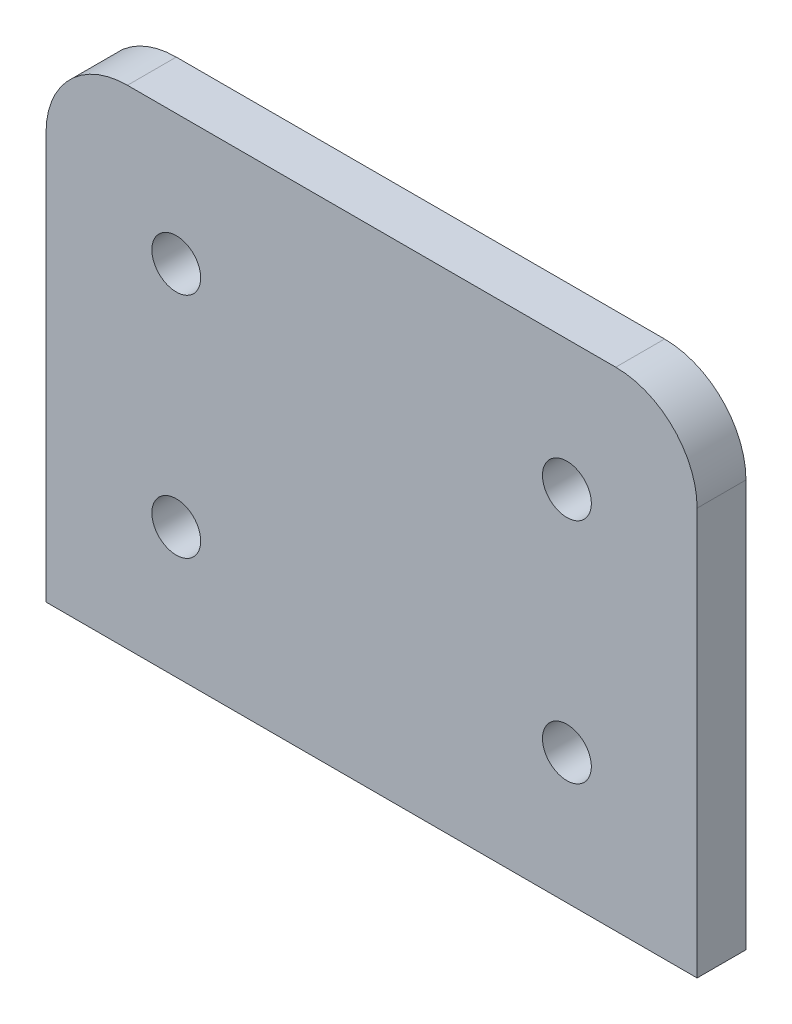
ISO-10303-21;
HEADER;
FILE_DESCRIPTION(('STEP AP214'),'2;1');
FILE_NAME('part.step','',(''),(''),'','','');
FILE_SCHEMA(('AUTOMOTIVE_DESIGN { 1 0 10303 214 1 1 1 1 }'));
ENDSEC;
DATA;
#1=APPLICATION_CONTEXT('core data for automotive mechanical design processes');
#2=APPLICATION_PROTOCOL_DEFINITION('international standard','automotive_design',2000,#1);
#3=PRODUCT_CONTEXT('',#1,'mechanical');
#4=PRODUCT('Part','Part','',(#3));
#5=PRODUCT_RELATED_PRODUCT_CATEGORY('part','',(#4));
#6=PRODUCT_DEFINITION_FORMATION('','',#4);
#7=PRODUCT_DEFINITION_CONTEXT('part definition',#1,'design');
#8=PRODUCT_DEFINITION('design','',#6,#7);
#9=PRODUCT_DEFINITION_SHAPE('','',#8);
#10=(LENGTH_UNIT() NAMED_UNIT(*) SI_UNIT(.MILLI.,.METRE.));
#11=(NAMED_UNIT(*) PLANE_ANGLE_UNIT() SI_UNIT($,.RADIAN.));
#12=(NAMED_UNIT(*) SI_UNIT($,.STERADIAN.) SOLID_ANGLE_UNIT());
#13=UNCERTAINTY_MEASURE_WITH_UNIT(LENGTH_MEASURE(1.E-05),#10,'distance_accuracy_value','');
#14=(GEOMETRIC_REPRESENTATION_CONTEXT(3) GLOBAL_UNCERTAINTY_ASSIGNED_CONTEXT((#13)) GLOBAL_UNIT_ASSIGNED_CONTEXT((#10,
#11,#12)) REPRESENTATION_CONTEXT('',''));
#15=CARTESIAN_POINT('',(0.,0.,0.));
#16=DIRECTION('',(0.,0.,1.));
#17=DIRECTION('',(1.,0.,0.));
#18=AXIS2_PLACEMENT_3D('',#15,#16,#17);
#19=CARTESIAN_POINT('',(0.,0.,3.));
#20=DIRECTION('',(0.,0.,1.));
#21=DIRECTION('',(1.,0.,0.));
#22=AXIS2_PLACEMENT_3D('',#19,#20,#21);
#23=PLANE('',#22);
#24=CARTESIAN_POINT('',(12.,-7.,3.));
#25=DIRECTION('',(0.,0.,1.));
#26=DIRECTION('',(-1.,0.,0.));
#27=AXIS2_PLACEMENT_3D('',#24,#25,#26);
#28=CIRCLE('',#27,1.5);
#29=CARTESIAN_POINT('',(10.5,-7.,3.));
#30=VERTEX_POINT('',#29);
#31=EDGE_CURVE('E183',#30,#30,#28,.T.);
#32=ORIENTED_EDGE('',*,*,#31,.F.);
#33=EDGE_LOOP('',(#32));
#34=FACE_BOUND('',#33,.T.);
#35=CARTESIAN_POINT('',(-12.,7.,3.));
#36=DIRECTION('',(0.,0.,1.));
#37=DIRECTION('',(1.,0.,0.));
#38=AXIS2_PLACEMENT_3D('',#35,#36,#37);
#39=CIRCLE('',#38,1.5);
#40=CARTESIAN_POINT('',(-10.5,7.,3.));
#41=VERTEX_POINT('',#40);
#42=EDGE_CURVE('E127',#41,#41,#39,.T.);
#43=ORIENTED_EDGE('',*,*,#42,.F.);
#44=EDGE_LOOP('',(#43));
#45=FACE_BOUND('',#44,.T.);
#46=DIRECTION('',(0.,1.,0.));
#47=VECTOR('',#46,1.);
#48=CARTESIAN_POINT('',(20.,15.,3.));
#49=LINE('',#48,#47);
#50=CARTESIAN_POINT('',(20.,-15.,3.));
#51=VERTEX_POINT('',#50);
#52=CARTESIAN_POINT('',(20.,10.,3.));
#53=VERTEX_POINT('',#52);
#54=EDGE_CURVE('E135',#51,#53,#49,.T.);
#55=ORIENTED_EDGE('',*,*,#54,.T.);
#56=CARTESIAN_POINT('',(15.,10.,3.));
#57=DIRECTION('',(0.,0.,1.));
#58=DIRECTION('',(1.,0.,0.));
#59=AXIS2_PLACEMENT_3D('',#56,#57,#58);
#60=CIRCLE('',#59,5.);
#61=CARTESIAN_POINT('',(15.,15.,3.));
#62=VERTEX_POINT('',#61);
#63=EDGE_CURVE('E48',#53,#62,#60,.T.);
#64=ORIENTED_EDGE('',*,*,#63,.T.);
#65=DIRECTION('',(-1.,0.,0.));
#66=VECTOR('',#65,1.);
#67=CARTESIAN_POINT('',(-20.,15.,3.));
#68=LINE('',#67,#66);
#69=CARTESIAN_POINT('',(-15.,15.,3.));
#70=VERTEX_POINT('',#69);
#71=EDGE_CURVE('E102',#62,#70,#68,.T.);
#72=ORIENTED_EDGE('',*,*,#71,.T.);
#73=CARTESIAN_POINT('',(-15.,10.,3.));
#74=DIRECTION('',(0.,0.,1.));
#75=DIRECTION('',(1.,0.,0.));
#76=AXIS2_PLACEMENT_3D('',#73,#74,#75);
#77=CIRCLE('',#76,5.);
#78=CARTESIAN_POINT('',(-20.,10.,3.));
#79=VERTEX_POINT('',#78);
#80=EDGE_CURVE('E55',#70,#79,#77,.T.);
#81=ORIENTED_EDGE('',*,*,#80,.T.);
#82=DIRECTION('',(0.,-1.,0.));
#83=VECTOR('',#82,1.);
#84=CARTESIAN_POINT('',(-20.,15.,3.));
#85=LINE('',#84,#83);
#86=CARTESIAN_POINT('',(-20.,-15.,3.));
#87=VERTEX_POINT('',#86);
#88=EDGE_CURVE('E93',#79,#87,#85,.T.);
#89=ORIENTED_EDGE('',*,*,#88,.T.);
#90=DIRECTION('',(1.,0.,0.));
#91=VECTOR('',#90,1.);
#92=CARTESIAN_POINT('',(-20.,-15.,3.));
#93=LINE('',#92,#91);
#94=EDGE_CURVE('E97',#87,#51,#93,.T.);
#95=ORIENTED_EDGE('',*,*,#94,.T.);
#96=EDGE_LOOP('',(#55,#64,#72,#81,#89,#95));
#97=FACE_BOUND('',#96,.T.);
#98=CARTESIAN_POINT('',(-12.,-7.,3.));
#99=DIRECTION('',(0.,0.,1.));
#100=DIRECTION('',(1.,0.,0.));
#101=AXIS2_PLACEMENT_3D('',#98,#99,#100);
#102=CIRCLE('',#101,1.5);
#103=CARTESIAN_POINT('',(-10.5,-7.,3.));
#104=VERTEX_POINT('',#103);
#105=EDGE_CURVE('E175',#104,#104,#102,.T.);
#106=ORIENTED_EDGE('',*,*,#105,.F.);
#107=EDGE_LOOP('',(#106));
#108=FACE_BOUND('',#107,.T.);
#109=CARTESIAN_POINT('',(12.,7.,3.));
#110=DIRECTION('',(0.,0.,1.));
#111=DIRECTION('',(-1.,0.,0.));
#112=AXIS2_PLACEMENT_3D('',#109,#110,#111);
#113=CIRCLE('',#112,1.5);
#114=CARTESIAN_POINT('',(10.5,7.,3.));
#115=VERTEX_POINT('',#114);
#116=EDGE_CURVE('E191',#115,#115,#113,.T.);
#117=ORIENTED_EDGE('',*,*,#116,.F.);
#118=EDGE_LOOP('',(#117));
#119=FACE_BOUND('',#118,.T.);
#120=ADVANCED_FACE('F39',(#34,#45,#97,#108,#119),#23,.T.);
#121=CARTESIAN_POINT('',(0.,0.,0.));
#122=DIRECTION('',(0.,0.,1.));
#123=DIRECTION('',(1.,0.,0.));
#124=AXIS2_PLACEMENT_3D('',#121,#122,#123);
#125=PLANE('',#124);
#126=DIRECTION('',(-1.,0.,0.));
#127=VECTOR('',#126,1.);
#128=CARTESIAN_POINT('',(-20.,15.,0.));
#129=LINE('',#128,#127);
#130=CARTESIAN_POINT('',(15.,15.,0.));
#131=VERTEX_POINT('',#130);
#132=CARTESIAN_POINT('',(-15.,15.,0.));
#133=VERTEX_POINT('',#132);
#134=EDGE_CURVE('E126',#131,#133,#129,.T.);
#135=ORIENTED_EDGE('',*,*,#134,.F.);
#136=CARTESIAN_POINT('',(15.,10.,0.));
#137=DIRECTION('',(0.,0.,1.));
#138=DIRECTION('',(1.,0.,0.));
#139=AXIS2_PLACEMENT_3D('',#136,#137,#138);
#140=CIRCLE('',#139,5.);
#141=CARTESIAN_POINT('',(20.,10.,0.));
#142=VERTEX_POINT('',#141);
#143=EDGE_CURVE('E146',#131,#142,#140,.F.);
#144=ORIENTED_EDGE('',*,*,#143,.T.);
#145=DIRECTION('',(0.,1.,0.));
#146=VECTOR('',#145,1.);
#147=CARTESIAN_POINT('',(20.,15.,0.));
#148=LINE('',#147,#146);
#149=CARTESIAN_POINT('',(20.,-15.,0.));
#150=VERTEX_POINT('',#149);
#151=EDGE_CURVE('E123',#150,#142,#148,.T.);
#152=ORIENTED_EDGE('',*,*,#151,.F.);
#153=DIRECTION('',(1.,0.,0.));
#154=VECTOR('',#153,1.);
#155=CARTESIAN_POINT('',(-20.,-15.,0.));
#156=LINE('',#155,#154);
#157=CARTESIAN_POINT('',(-20.,-15.,0.));
#158=VERTEX_POINT('',#157);
#159=EDGE_CURVE('E133',#158,#150,#156,.T.);
#160=ORIENTED_EDGE('',*,*,#159,.F.);
#161=DIRECTION('',(0.,-1.,0.));
#162=VECTOR('',#161,1.);
#163=CARTESIAN_POINT('',(-20.,15.,0.));
#164=LINE('',#163,#162);
#165=CARTESIAN_POINT('',(-20.,10.,0.));
#166=VERTEX_POINT('',#165);
#167=EDGE_CURVE('E108',#166,#158,#164,.T.);
#168=ORIENTED_EDGE('',*,*,#167,.F.);
#169=CARTESIAN_POINT('',(-15.,10.,0.));
#170=DIRECTION('',(0.,0.,1.));
#171=DIRECTION('',(1.,0.,0.));
#172=AXIS2_PLACEMENT_3D('',#169,#170,#171);
#173=CIRCLE('',#172,5.);
#174=EDGE_CURVE('E143',#166,#133,#173,.F.);
#175=ORIENTED_EDGE('',*,*,#174,.T.);
#176=EDGE_LOOP('',(#135,#144,#152,#160,#168,#175));
#177=FACE_BOUND('',#176,.T.);
#178=CARTESIAN_POINT('',(-12.,7.,0.));
#179=DIRECTION('',(0.,0.,1.));
#180=DIRECTION('',(1.,0.,0.));
#181=AXIS2_PLACEMENT_3D('',#178,#179,#180);
#182=CIRCLE('',#181,1.5);
#183=CARTESIAN_POINT('',(-10.5,7.,0.));
#184=VERTEX_POINT('',#183);
#185=EDGE_CURVE('E171',#184,#184,#182,.T.);
#186=ORIENTED_EDGE('',*,*,#185,.T.);
#187=EDGE_LOOP('',(#186));
#188=FACE_BOUND('',#187,.T.);
#189=CARTESIAN_POINT('',(-12.,-7.,0.));
#190=DIRECTION('',(0.,0.,1.));
#191=DIRECTION('',(1.,0.,0.));
#192=AXIS2_PLACEMENT_3D('',#189,#190,#191);
#193=CIRCLE('',#192,1.5);
#194=CARTESIAN_POINT('',(-10.5,-7.,0.));
#195=VERTEX_POINT('',#194);
#196=EDGE_CURVE('E179',#195,#195,#193,.T.);
#197=ORIENTED_EDGE('',*,*,#196,.T.);
#198=EDGE_LOOP('',(#197));
#199=FACE_BOUND('',#198,.T.);
#200=CARTESIAN_POINT('',(12.,-7.,0.));
#201=DIRECTION('',(0.,0.,1.));
#202=DIRECTION('',(-1.,0.,0.));
#203=AXIS2_PLACEMENT_3D('',#200,#201,#202);
#204=CIRCLE('',#203,1.5);
#205=CARTESIAN_POINT('',(10.5,-7.,0.));
#206=VERTEX_POINT('',#205);
#207=EDGE_CURVE('E187',#206,#206,#204,.T.);
#208=ORIENTED_EDGE('',*,*,#207,.T.);
#209=EDGE_LOOP('',(#208));
#210=FACE_BOUND('',#209,.T.);
#211=CARTESIAN_POINT('',(12.,7.,0.));
#212=DIRECTION('',(0.,0.,1.));
#213=DIRECTION('',(-1.,0.,0.));
#214=AXIS2_PLACEMENT_3D('',#211,#212,#213);
#215=CIRCLE('',#214,1.5);
#216=CARTESIAN_POINT('',(10.5,7.,0.));
#217=VERTEX_POINT('',#216);
#218=EDGE_CURVE('E195',#217,#217,#215,.T.);
#219=ORIENTED_EDGE('',*,*,#218,.T.);
#220=EDGE_LOOP('',(#219));
#221=FACE_BOUND('',#220,.T.);
#222=ADVANCED_FACE('F165',(#177,#188,#199,#210,#221),#125,.F.);
#223=CARTESIAN_POINT('',(20.,15.,3.));
#224=DIRECTION('',(-1.,0.,0.));
#225=DIRECTION('',(0.,-1.,0.));
#226=AXIS2_PLACEMENT_3D('',#223,#224,#225);
#227=PLANE('',#226);
#228=ORIENTED_EDGE('',*,*,#151,.T.);
#229=DIRECTION('',(0.,0.,-1.));
#230=VECTOR('',#229,1.);
#231=CARTESIAN_POINT('',(20.,10.,3.));
#232=LINE('',#231,#230);
#233=EDGE_CURVE('E63',#142,#53,#232,.F.);
#234=ORIENTED_EDGE('',*,*,#233,.T.);
#235=ORIENTED_EDGE('',*,*,#54,.F.);
#236=DIRECTION('',(0.,0.,-1.));
#237=VECTOR('',#236,1.);
#238=CARTESIAN_POINT('',(20.,-15.,3.));
#239=LINE('',#238,#237);
#240=EDGE_CURVE('E113',#51,#150,#239,.T.);
#241=ORIENTED_EDGE('',*,*,#240,.T.);
#242=EDGE_LOOP('',(#228,#234,#235,#241));
#243=FACE_BOUND('',#242,.T.);
#244=ADVANCED_FACE('F167',(#243),#227,.F.);
#245=CARTESIAN_POINT('',(-20.,15.,3.));
#246=DIRECTION('',(0.,-1.,0.));
#247=DIRECTION('',(0.,0.,-1.));
#248=AXIS2_PLACEMENT_3D('',#245,#246,#247);
#249=PLANE('',#248);
#250=ORIENTED_EDGE('',*,*,#71,.F.);
#251=DIRECTION('',(0.,0.,-1.));
#252=VECTOR('',#251,1.);
#253=CARTESIAN_POINT('',(15.,15.,3.));
#254=LINE('',#253,#252);
#255=EDGE_CURVE('E139',#62,#131,#254,.T.);
#256=ORIENTED_EDGE('',*,*,#255,.T.);
#257=ORIENTED_EDGE('',*,*,#134,.T.);
#258=DIRECTION('',(0.,0.,-1.));
#259=VECTOR('',#258,1.);
#260=CARTESIAN_POINT('',(-15.,15.,3.));
#261=LINE('',#260,#259);
#262=EDGE_CURVE('E112',#133,#70,#261,.F.);
#263=ORIENTED_EDGE('',*,*,#262,.T.);
#264=EDGE_LOOP('',(#250,#256,#257,#263));
#265=FACE_BOUND('',#264,.T.);
#266=ADVANCED_FACE('F158',(#265),#249,.F.);
#267=CARTESIAN_POINT('',(-20.,15.,3.));
#268=DIRECTION('',(1.,0.,0.));
#269=DIRECTION('',(0.,1.,0.));
#270=AXIS2_PLACEMENT_3D('',#267,#268,#269);
#271=PLANE('',#270);
#272=ORIENTED_EDGE('',*,*,#88,.F.);
#273=DIRECTION('',(0.,0.,-1.));
#274=VECTOR('',#273,1.);
#275=CARTESIAN_POINT('',(-20.,10.,3.));
#276=LINE('',#275,#274);
#277=EDGE_CURVE('E11',#79,#166,#276,.T.);
#278=ORIENTED_EDGE('',*,*,#277,.T.);
#279=ORIENTED_EDGE('',*,*,#167,.T.);
#280=DIRECTION('',(0.,0.,-1.));
#281=VECTOR('',#280,1.);
#282=CARTESIAN_POINT('',(-20.,-15.,3.));
#283=LINE('',#282,#281);
#284=EDGE_CURVE('E105',#87,#158,#283,.T.);
#285=ORIENTED_EDGE('',*,*,#284,.F.);
#286=EDGE_LOOP('',(#272,#278,#279,#285));
#287=FACE_BOUND('',#286,.T.);
#288=ADVANCED_FACE('F106',(#287),#271,.F.);
#289=CARTESIAN_POINT('',(-20.,-15.,3.));
#290=DIRECTION('',(0.,1.,0.));
#291=DIRECTION('',(0.,0.,1.));
#292=AXIS2_PLACEMENT_3D('',#289,#290,#291);
#293=PLANE('',#292);
#294=ORIENTED_EDGE('',*,*,#159,.T.);
#295=ORIENTED_EDGE('',*,*,#240,.F.);
#296=ORIENTED_EDGE('',*,*,#94,.F.);
#297=ORIENTED_EDGE('',*,*,#284,.T.);
#298=EDGE_LOOP('',(#294,#295,#296,#297));
#299=FACE_BOUND('',#298,.T.);
#300=ADVANCED_FACE('F115',(#299),#293,.F.);
#301=CARTESIAN_POINT('',(-12.,7.,3.));
#302=DIRECTION('',(0.,0.,-1.));
#303=DIRECTION('',(-1.,0.,0.));
#304=AXIS2_PLACEMENT_3D('',#301,#302,#303);
#305=CYLINDRICAL_SURFACE('',#304,1.5);
#306=ORIENTED_EDGE('',*,*,#42,.T.);
#307=EDGE_LOOP('',(#306));
#308=FACE_BOUND('',#307,.T.);
#309=ORIENTED_EDGE('',*,*,#185,.F.);
#310=EDGE_LOOP('',(#309));
#311=FACE_BOUND('',#310,.T.);
#312=ADVANCED_FACE('F216',(#308,#311),#305,.F.);
#313=CARTESIAN_POINT('',(-12.,-7.,3.));
#314=DIRECTION('',(0.,0.,-1.));
#315=DIRECTION('',(-1.,0.,0.));
#316=AXIS2_PLACEMENT_3D('',#313,#314,#315);
#317=CYLINDRICAL_SURFACE('',#316,1.5);
#318=ORIENTED_EDGE('',*,*,#105,.T.);
#319=EDGE_LOOP('',(#318));
#320=FACE_BOUND('',#319,.T.);
#321=ORIENTED_EDGE('',*,*,#196,.F.);
#322=EDGE_LOOP('',(#321));
#323=FACE_BOUND('',#322,.T.);
#324=ADVANCED_FACE('F237',(#320,#323),#317,.F.);
#325=CARTESIAN_POINT('',(12.,-7.,3.));
#326=DIRECTION('',(0.,0.,-1.));
#327=DIRECTION('',(-1.,0.,0.));
#328=AXIS2_PLACEMENT_3D('',#325,#326,#327);
#329=CYLINDRICAL_SURFACE('',#328,1.5);
#330=ORIENTED_EDGE('',*,*,#31,.T.);
#331=EDGE_LOOP('',(#330));
#332=FACE_BOUND('',#331,.T.);
#333=ORIENTED_EDGE('',*,*,#207,.F.);
#334=EDGE_LOOP('',(#333));
#335=FACE_BOUND('',#334,.T.);
#336=ADVANCED_FACE('F232',(#332,#335),#329,.F.);
#337=CARTESIAN_POINT('',(12.,7.,3.));
#338=DIRECTION('',(0.,0.,-1.));
#339=DIRECTION('',(-1.,0.,0.));
#340=AXIS2_PLACEMENT_3D('',#337,#338,#339);
#341=CYLINDRICAL_SURFACE('',#340,1.5);
#342=ORIENTED_EDGE('',*,*,#116,.T.);
#343=EDGE_LOOP('',(#342));
#344=FACE_BOUND('',#343,.T.);
#345=ORIENTED_EDGE('',*,*,#218,.F.);
#346=EDGE_LOOP('',(#345));
#347=FACE_BOUND('',#346,.T.);
#348=ADVANCED_FACE('F203',(#344,#347),#341,.F.);
#349=CARTESIAN_POINT('',(15.,10.,3.));
#350=DIRECTION('',(0.,0.,-1.));
#351=DIRECTION('',(-1.,0.,0.));
#352=AXIS2_PLACEMENT_3D('',#349,#350,#351);
#353=CYLINDRICAL_SURFACE('',#352,5.);
#354=ORIENTED_EDGE('',*,*,#63,.F.);
#355=ORIENTED_EDGE('',*,*,#233,.F.);
#356=ORIENTED_EDGE('',*,*,#143,.F.);
#357=ORIENTED_EDGE('',*,*,#255,.F.);
#358=EDGE_LOOP('',(#354,#355,#356,#357));
#359=FACE_BOUND('',#358,.T.);
#360=ADVANCED_FACE('F162',(#359),#353,.T.);
#361=CARTESIAN_POINT('',(-15.,10.,3.));
#362=DIRECTION('',(0.,0.,-1.));
#363=DIRECTION('',(-1.,0.,0.));
#364=AXIS2_PLACEMENT_3D('',#361,#362,#363);
#365=CYLINDRICAL_SURFACE('',#364,5.);
#366=ORIENTED_EDGE('',*,*,#80,.F.);
#367=ORIENTED_EDGE('',*,*,#262,.F.);
#368=ORIENTED_EDGE('',*,*,#174,.F.);
#369=ORIENTED_EDGE('',*,*,#277,.F.);
#370=EDGE_LOOP('',(#366,#367,#368,#369));
#371=FACE_BOUND('',#370,.T.);
#372=ADVANCED_FACE('F41',(#371),#365,.T.);
#373=CLOSED_SHELL('',(#120,#222,#244,#266,#288,#300,#312,#324,#336,#348,#360,#372));
#374=MANIFOLD_SOLID_BREP('B2',#373);
#375=ADVANCED_BREP_SHAPE_REPRESENTATION('',(#18,#374),#14);
#376=SHAPE_DEFINITION_REPRESENTATION(#9,#375);
ENDSEC;
END-ISO-10303-21;
